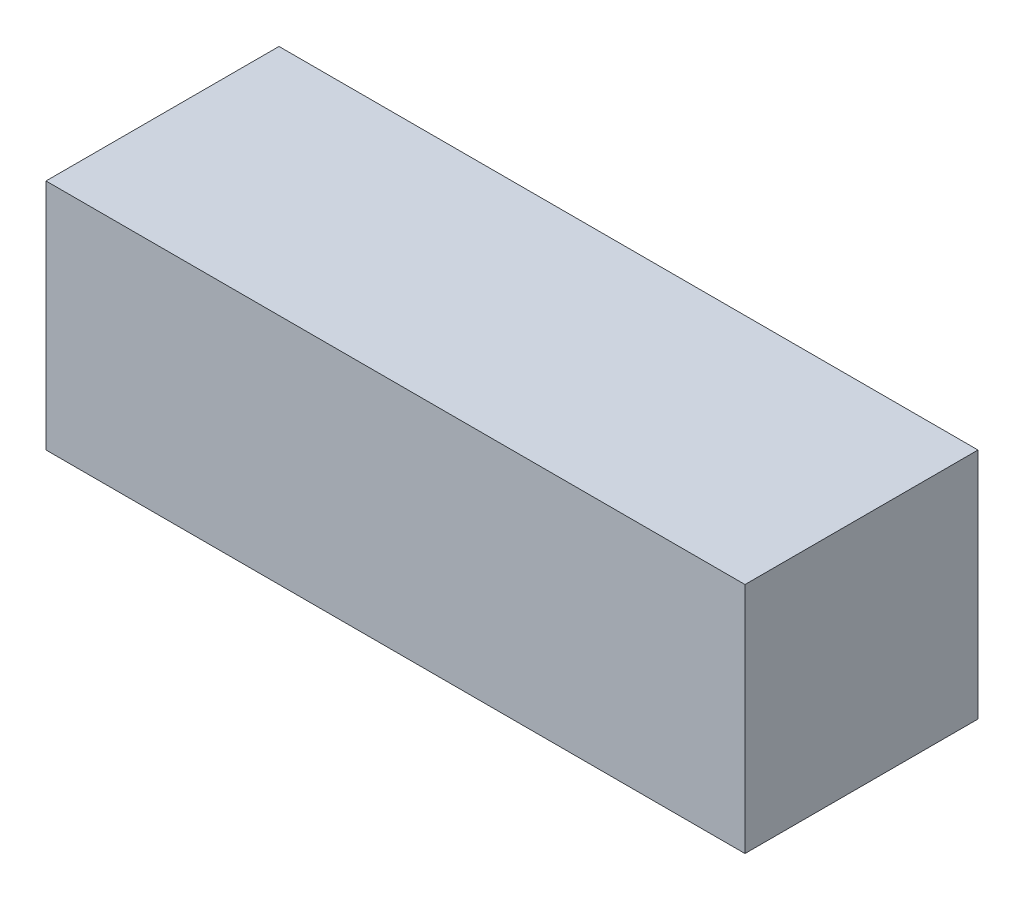
ISO-10303-21;
HEADER;
FILE_DESCRIPTION(('STEP AP214'),'2;1');
FILE_NAME('part.step','',(''),(''),'','','');
FILE_SCHEMA(('AUTOMOTIVE_DESIGN { 1 0 10303 214 1 1 1 1 }'));
ENDSEC;
DATA;
#1=APPLICATION_CONTEXT('core data for automotive mechanical design processes');
#2=APPLICATION_PROTOCOL_DEFINITION('international standard','automotive_design',2000,#1);
#3=PRODUCT_CONTEXT('',#1,'mechanical');
#4=PRODUCT('Part','Part','',(#3));
#5=PRODUCT_RELATED_PRODUCT_CATEGORY('part','',(#4));
#6=PRODUCT_DEFINITION_FORMATION('','',#4);
#7=PRODUCT_DEFINITION_CONTEXT('part definition',#1,'design');
#8=PRODUCT_DEFINITION('design','',#6,#7);
#9=PRODUCT_DEFINITION_SHAPE('','',#8);
#10=(LENGTH_UNIT() NAMED_UNIT(*) SI_UNIT(.MILLI.,.METRE.));
#11=(NAMED_UNIT(*) PLANE_ANGLE_UNIT() SI_UNIT($,.RADIAN.));
#12=(NAMED_UNIT(*) SI_UNIT($,.STERADIAN.) SOLID_ANGLE_UNIT());
#13=UNCERTAINTY_MEASURE_WITH_UNIT(LENGTH_MEASURE(1.E-05),#10,'distance_accuracy_value','');
#14=(GEOMETRIC_REPRESENTATION_CONTEXT(3) GLOBAL_UNCERTAINTY_ASSIGNED_CONTEXT((#13)) GLOBAL_UNIT_ASSIGNED_CONTEXT((#10,
#11,#12)) REPRESENTATION_CONTEXT('',''));
#15=CARTESIAN_POINT('',(0.,0.,0.));
#16=DIRECTION('',(0.,0.,1.));
#17=DIRECTION('',(1.,0.,0.));
#18=AXIS2_PLACEMENT_3D('',#15,#16,#17);
#19=CARTESIAN_POINT('',(0.,50.8,0.));
#20=DIRECTION('',(0.,0.,-1.));
#21=DIRECTION('',(-1.,0.,0.));
#22=AXIS2_PLACEMENT_3D('',#19,#20,#21);
#23=PLANE('',#22);
#24=DIRECTION('',(1.,0.,0.));
#25=VECTOR('',#24,1.);
#26=CARTESIAN_POINT('',(0.,0.,0.));
#27=LINE('',#26,#25);
#28=CARTESIAN_POINT('',(0.,0.,0.));
#29=VERTEX_POINT('',#28);
#30=CARTESIAN_POINT('',(152.4,0.,0.));
#31=VERTEX_POINT('',#30);
#32=EDGE_CURVE('E101',#29,#31,#27,.T.);
#33=ORIENTED_EDGE('',*,*,#32,.T.);
#34=DIRECTION('',(0.,-1.,0.));
#35=VECTOR('',#34,1.);
#36=CARTESIAN_POINT('',(152.4,50.8,0.));
#37=LINE('',#36,#35);
#38=CARTESIAN_POINT('',(152.4,50.8,0.));
#39=VERTEX_POINT('',#38);
#40=EDGE_CURVE('E11',#39,#31,#37,.T.);
#41=ORIENTED_EDGE('',*,*,#40,.F.);
#42=DIRECTION('',(1.,0.,0.));
#43=VECTOR('',#42,1.);
#44=CARTESIAN_POINT('',(0.,50.8,0.));
#45=LINE('',#44,#43);
#46=CARTESIAN_POINT('',(0.,50.8,0.));
#47=VERTEX_POINT('',#46);
#48=EDGE_CURVE('E87',#47,#39,#45,.T.);
#49=ORIENTED_EDGE('',*,*,#48,.F.);
#50=DIRECTION('',(0.,-1.,0.));
#51=VECTOR('',#50,1.);
#52=CARTESIAN_POINT('',(0.,50.8,0.));
#53=LINE('',#52,#51);
#54=EDGE_CURVE('E54',#47,#29,#53,.T.);
#55=ORIENTED_EDGE('',*,*,#54,.T.);
#56=EDGE_LOOP('',(#33,#41,#49,#55));
#57=FACE_BOUND('',#56,.T.);
#58=ADVANCED_FACE('F38',(#57),#23,.F.);
#59=CARTESIAN_POINT('',(152.4,50.8,0.));
#60=DIRECTION('',(-1.,0.,0.));
#61=DIRECTION('',(0.,0.,1.));
#62=AXIS2_PLACEMENT_3D('',#59,#60,#61);
#63=PLANE('',#62);
#64=DIRECTION('',(0.,0.,-1.));
#65=VECTOR('',#64,1.);
#66=CARTESIAN_POINT('',(152.4,0.,0.));
#67=LINE('',#66,#65);
#68=CARTESIAN_POINT('',(152.4,0.,-50.8));
#69=VERTEX_POINT('',#68);
#70=EDGE_CURVE('E92',#31,#69,#67,.T.);
#71=ORIENTED_EDGE('',*,*,#70,.T.);
#72=DIRECTION('',(0.,-1.,0.));
#73=VECTOR('',#72,1.);
#74=CARTESIAN_POINT('',(152.4,50.8,-50.8));
#75=LINE('',#74,#73);
#76=CARTESIAN_POINT('',(152.4,50.8,-50.8));
#77=VERTEX_POINT('',#76);
#78=EDGE_CURVE('E46',#77,#69,#75,.T.);
#79=ORIENTED_EDGE('',*,*,#78,.F.);
#80=DIRECTION('',(0.,0.,-1.));
#81=VECTOR('',#80,1.);
#82=CARTESIAN_POINT('',(152.4,50.8,0.));
#83=LINE('',#82,#81);
#84=EDGE_CURVE('E79',#39,#77,#83,.T.);
#85=ORIENTED_EDGE('',*,*,#84,.F.);
#86=ORIENTED_EDGE('',*,*,#40,.T.);
#87=EDGE_LOOP('',(#71,#79,#85,#86));
#88=FACE_BOUND('',#87,.T.);
#89=ADVANCED_FACE('F91',(#88),#63,.F.);
#90=CARTESIAN_POINT('',(0.,50.8,-50.8));
#91=DIRECTION('',(0.,0.,-1.));
#92=DIRECTION('',(-1.,0.,0.));
#93=AXIS2_PLACEMENT_3D('',#90,#91,#92);
#94=PLANE('',#93);
#95=DIRECTION('',(1.,0.,0.));
#96=VECTOR('',#95,1.);
#97=CARTESIAN_POINT('',(0.,0.,-50.8));
#98=LINE('',#97,#96);
#99=CARTESIAN_POINT('',(0.,0.,-50.8));
#100=VERTEX_POINT('',#99);
#101=EDGE_CURVE('E104',#100,#69,#98,.T.);
#102=ORIENTED_EDGE('',*,*,#101,.F.);
#103=DIRECTION('',(0.,-1.,0.));
#104=VECTOR('',#103,1.);
#105=CARTESIAN_POINT('',(0.,50.8,-50.8));
#106=LINE('',#105,#104);
#107=CARTESIAN_POINT('',(0.,50.8,-50.8));
#108=VERTEX_POINT('',#107);
#109=EDGE_CURVE('E68',#108,#100,#106,.T.);
#110=ORIENTED_EDGE('',*,*,#109,.F.);
#111=DIRECTION('',(1.,0.,0.));
#112=VECTOR('',#111,1.);
#113=CARTESIAN_POINT('',(0.,50.8,-50.8));
#114=LINE('',#113,#112);
#115=EDGE_CURVE('E86',#108,#77,#114,.T.);
#116=ORIENTED_EDGE('',*,*,#115,.T.);
#117=ORIENTED_EDGE('',*,*,#78,.T.);
#118=EDGE_LOOP('',(#102,#110,#116,#117));
#119=FACE_BOUND('',#118,.T.);
#120=ADVANCED_FACE('F95',(#119),#94,.T.);
#121=CARTESIAN_POINT('',(0.,50.8,0.));
#122=DIRECTION('',(-1.,0.,0.));
#123=DIRECTION('',(0.,0.,1.));
#124=AXIS2_PLACEMENT_3D('',#121,#122,#123);
#125=PLANE('',#124);
#126=DIRECTION('',(0.,0.,-1.));
#127=VECTOR('',#126,1.);
#128=CARTESIAN_POINT('',(0.,0.,0.));
#129=LINE('',#128,#127);
#130=EDGE_CURVE('E106',#29,#100,#129,.T.);
#131=ORIENTED_EDGE('',*,*,#130,.F.);
#132=ORIENTED_EDGE('',*,*,#54,.F.);
#133=DIRECTION('',(0.,0.,-1.));
#134=VECTOR('',#133,1.);
#135=CARTESIAN_POINT('',(0.,50.8,0.));
#136=LINE('',#135,#134);
#137=EDGE_CURVE('E96',#47,#108,#136,.T.);
#138=ORIENTED_EDGE('',*,*,#137,.T.);
#139=ORIENTED_EDGE('',*,*,#109,.T.);
#140=EDGE_LOOP('',(#131,#132,#138,#139));
#141=FACE_BOUND('',#140,.T.);
#142=ADVANCED_FACE('F112',(#141),#125,.T.);
#143=CARTESIAN_POINT('',(0.,50.8,0.));
#144=DIRECTION('',(0.,1.,0.));
#145=DIRECTION('',(0.,0.,1.));
#146=AXIS2_PLACEMENT_3D('',#143,#144,#145);
#147=PLANE('',#146);
#148=ORIENTED_EDGE('',*,*,#48,.T.);
#149=ORIENTED_EDGE('',*,*,#84,.T.);
#150=ORIENTED_EDGE('',*,*,#115,.F.);
#151=ORIENTED_EDGE('',*,*,#137,.F.);
#152=EDGE_LOOP('',(#148,#149,#150,#151));
#153=FACE_BOUND('',#152,.T.);
#154=ADVANCED_FACE('F83',(#153),#147,.T.);
#155=CARTESIAN_POINT('',(0.,0.,0.));
#156=DIRECTION('',(0.,1.,0.));
#157=DIRECTION('',(0.,0.,1.));
#158=AXIS2_PLACEMENT_3D('',#155,#156,#157);
#159=PLANE('',#158);
#160=ORIENTED_EDGE('',*,*,#32,.F.);
#161=ORIENTED_EDGE('',*,*,#130,.T.);
#162=ORIENTED_EDGE('',*,*,#101,.T.);
#163=ORIENTED_EDGE('',*,*,#70,.F.);
#164=EDGE_LOOP('',(#160,#161,#162,#163));
#165=FACE_BOUND('',#164,.T.);
#166=ADVANCED_FACE('F111',(#165),#159,.F.);
#167=CLOSED_SHELL('',(#58,#89,#120,#142,#154,#166));
#168=MANIFOLD_SOLID_BREP('B2',#167);
#169=ADVANCED_BREP_SHAPE_REPRESENTATION('',(#18,#168),#14);
#170=SHAPE_DEFINITION_REPRESENTATION(#9,#169);
ENDSEC;
END-ISO-10303-21;
